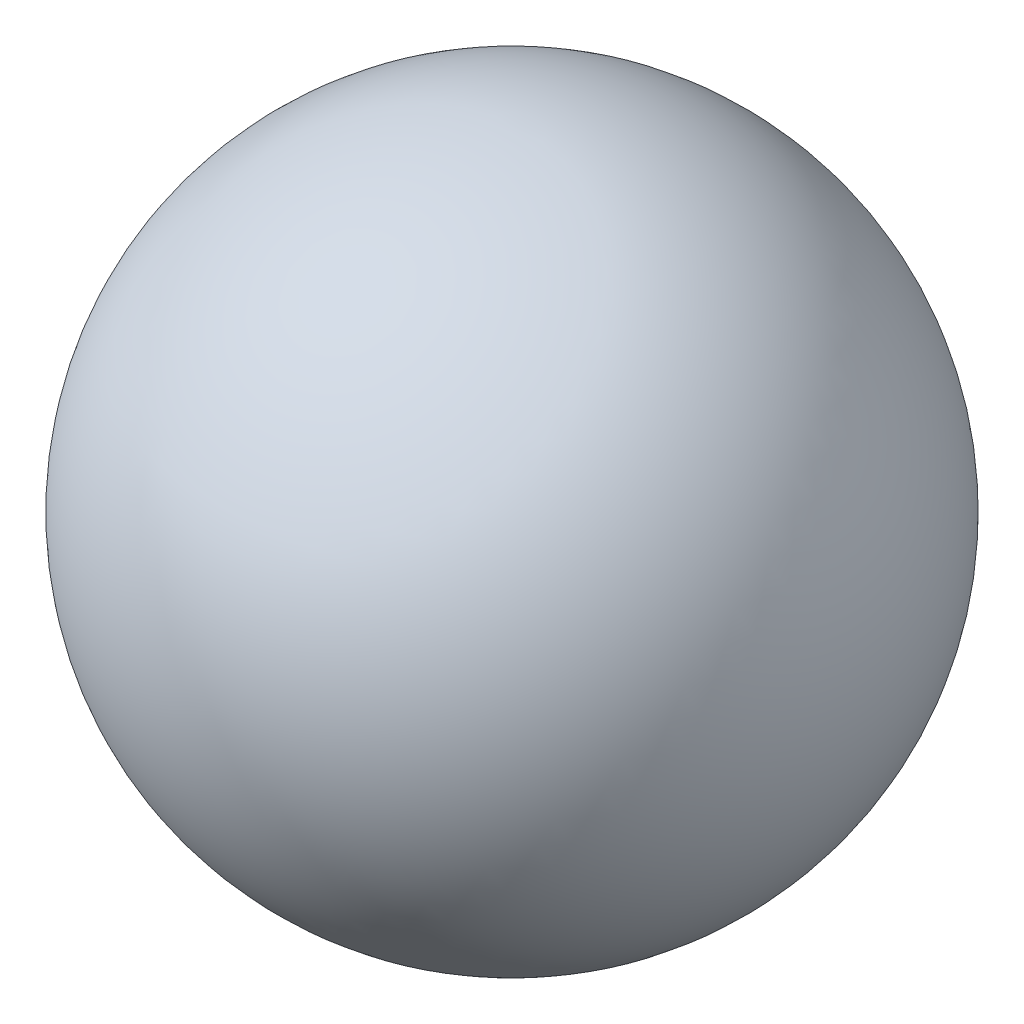
ISO-10303-21;
HEADER;
FILE_DESCRIPTION(('STEP AP214'),'2;1');
FILE_NAME('part.step','',(''),(''),'','','');
FILE_SCHEMA(('AUTOMOTIVE_DESIGN { 1 0 10303 214 1 1 1 1 }'));
ENDSEC;
DATA;
#1=APPLICATION_CONTEXT('core data for automotive mechanical design processes');
#2=APPLICATION_PROTOCOL_DEFINITION('international standard','automotive_design',2000,#1);
#3=PRODUCT_CONTEXT('',#1,'mechanical');
#4=PRODUCT('Part','Part','',(#3));
#5=PRODUCT_RELATED_PRODUCT_CATEGORY('part','',(#4));
#6=PRODUCT_DEFINITION_FORMATION('','',#4);
#7=PRODUCT_DEFINITION_CONTEXT('part definition',#1,'design');
#8=PRODUCT_DEFINITION('design','',#6,#7);
#9=PRODUCT_DEFINITION_SHAPE('','',#8);
#10=(LENGTH_UNIT() NAMED_UNIT(*) SI_UNIT(.MILLI.,.METRE.));
#11=(NAMED_UNIT(*) PLANE_ANGLE_UNIT() SI_UNIT($,.RADIAN.));
#12=(NAMED_UNIT(*) SI_UNIT($,.STERADIAN.) SOLID_ANGLE_UNIT());
#13=UNCERTAINTY_MEASURE_WITH_UNIT(LENGTH_MEASURE(1.E-05),#10,'distance_accuracy_value','');
#14=(GEOMETRIC_REPRESENTATION_CONTEXT(3) GLOBAL_UNCERTAINTY_ASSIGNED_CONTEXT((#13)) GLOBAL_UNIT_ASSIGNED_CONTEXT((#10,
#11,#12)) REPRESENTATION_CONTEXT('',''));
#15=CARTESIAN_POINT('',(0.,0.,0.));
#16=DIRECTION('',(0.,0.,1.));
#17=DIRECTION('',(1.,0.,0.));
#18=AXIS2_PLACEMENT_3D('',#15,#16,#17);
#19=CARTESIAN_POINT('',(0.,0.,0.));
#20=DIRECTION('',(0.,-1.,0.));
#21=DIRECTION('',(-1.,0.,0.));
#22=AXIS2_PLACEMENT_3D('',#19,#20,#21);
#23=SPHERICAL_SURFACE('',#22,2.25);
#24=CARTESIAN_POINT('',(0.,-2.25,0.));
#25=VERTEX_POINT('',#24);
#26=VERTEX_LOOP('',#25);
#27=FACE_BOUND('',#26,.T.);
#28=ADVANCED_FACE('F34',(#27),#23,.T.);
#29=CLOSED_SHELL('',(#28));
#30=MANIFOLD_SOLID_BREP('B2',#29);
#31=ADVANCED_BREP_SHAPE_REPRESENTATION('',(#18,#30),#14);
#32=SHAPE_DEFINITION_REPRESENTATION(#9,#31);
ENDSEC;
END-ISO-10303-21;
